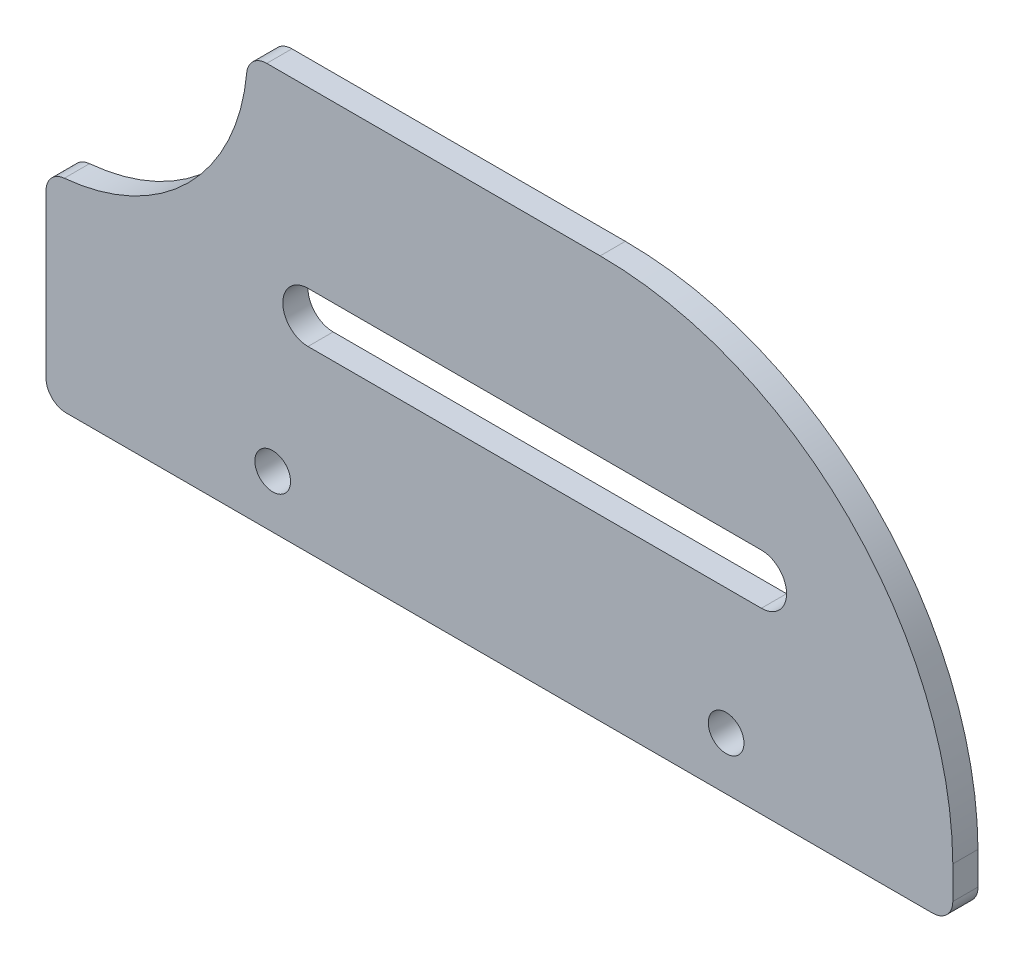
ISO-10303-21;
HEADER;
FILE_DESCRIPTION(('STEP AP214'),'2;1');
FILE_NAME('part.step','',(''),(''),'','','');
FILE_SCHEMA(('AUTOMOTIVE_DESIGN { 1 0 10303 214 1 1 1 1 }'));
ENDSEC;
DATA;
#1=APPLICATION_CONTEXT('core data for automotive mechanical design processes');
#2=APPLICATION_PROTOCOL_DEFINITION('international standard','automotive_design',2000,#1);
#3=PRODUCT_CONTEXT('',#1,'mechanical');
#4=PRODUCT('Part','Part','',(#3));
#5=PRODUCT_RELATED_PRODUCT_CATEGORY('part','',(#4));
#6=PRODUCT_DEFINITION_FORMATION('','',#4);
#7=PRODUCT_DEFINITION_CONTEXT('part definition',#1,'design');
#8=PRODUCT_DEFINITION('design','',#6,#7);
#9=PRODUCT_DEFINITION_SHAPE('','',#8);
#10=(LENGTH_UNIT() NAMED_UNIT(*) SI_UNIT(.MILLI.,.METRE.));
#11=(NAMED_UNIT(*) PLANE_ANGLE_UNIT() SI_UNIT($,.RADIAN.));
#12=(NAMED_UNIT(*) SI_UNIT($,.STERADIAN.) SOLID_ANGLE_UNIT());
#13=UNCERTAINTY_MEASURE_WITH_UNIT(LENGTH_MEASURE(1.E-05),#10,'distance_accuracy_value','');
#14=(GEOMETRIC_REPRESENTATION_CONTEXT(3) GLOBAL_UNCERTAINTY_ASSIGNED_CONTEXT((#13)) GLOBAL_UNIT_ASSIGNED_CONTEXT((#10,
#11,#12)) REPRESENTATION_CONTEXT('',''));
#15=CARTESIAN_POINT('',(0.,0.,0.));
#16=DIRECTION('',(0.,0.,1.));
#17=DIRECTION('',(1.,0.,0.));
#18=AXIS2_PLACEMENT_3D('',#15,#16,#17);
#19=CARTESIAN_POINT('',(0.,50.8,3.175));
#20=DIRECTION('',(0.,1.,0.));
#21=DIRECTION('',(0.,0.,1.));
#22=AXIS2_PLACEMENT_3D('',#19,#20,#21);
#23=PLANE('',#22);
#24=DIRECTION('',(1.,0.,0.));
#25=VECTOR('',#24,1.);
#26=CARTESIAN_POINT('',(0.,50.8,0.));
#27=LINE('',#26,#25);
#28=CARTESIAN_POINT('',(27.8243059212624,50.8,0.));
#29=VERTEX_POINT('',#28);
#30=CARTESIAN_POINT('',(69.85,50.8,0.));
#31=VERTEX_POINT('',#30);
#32=EDGE_CURVE('E234',#29,#31,#27,.T.);
#33=ORIENTED_EDGE('',*,*,#32,.F.);
#34=DIRECTION('',(0.,0.,1.));
#35=VECTOR('',#34,1.);
#36=CARTESIAN_POINT('',(27.8243059212624,50.8,3.175));
#37=LINE('',#36,#35);
#38=CARTESIAN_POINT('',(27.8243059212624,50.8,3.175));
#39=VERTEX_POINT('',#38);
#40=EDGE_CURVE('E273',#29,#39,#37,.T.);
#41=ORIENTED_EDGE('',*,*,#40,.T.);
#42=DIRECTION('',(1.,0.,0.));
#43=VECTOR('',#42,1.);
#44=CARTESIAN_POINT('',(0.,50.8,3.175));
#45=LINE('',#44,#43);
#46=CARTESIAN_POINT('',(69.85,50.8,3.175));
#47=VERTEX_POINT('',#46);
#48=EDGE_CURVE('E237',#39,#47,#45,.T.);
#49=ORIENTED_EDGE('',*,*,#48,.T.);
#50=DIRECTION('',(0.,0.,1.));
#51=VECTOR('',#50,1.);
#52=CARTESIAN_POINT('',(69.85,50.8,0.));
#53=LINE('',#52,#51);
#54=EDGE_CURVE('E226',#31,#47,#53,.T.);
#55=ORIENTED_EDGE('',*,*,#54,.F.);
#56=EDGE_LOOP('',(#33,#41,#49,#55));
#57=FACE_BOUND('',#56,.T.);
#58=ADVANCED_FACE('F73',(#57),#23,.T.);
#59=CARTESIAN_POINT('',(0.,0.,3.175));
#60=DIRECTION('',(0.,0.,1.));
#61=DIRECTION('',(1.,0.,0.));
#62=AXIS2_PLACEMENT_3D('',#59,#60,#61);
#63=PLANE('',#62);
#64=CARTESIAN_POINT('',(28.575,6.65,3.175));
#65=DIRECTION('',(0.,0.,1.));
#66=DIRECTION('',(1.,0.,0.));
#67=AXIS2_PLACEMENT_3D('',#64,#65,#66);
#68=CIRCLE('',#67,2.25);
#69=CARTESIAN_POINT('',(30.825,6.65,3.175));
#70=VERTEX_POINT('',#69);
#71=EDGE_CURVE('E489',#70,#70,#68,.T.);
#72=ORIENTED_EDGE('',*,*,#71,.F.);
#73=EDGE_LOOP('',(#72));
#74=FACE_BOUND('',#73,.T.);
#75=ORIENTED_EDGE('',*,*,#48,.F.);
#76=CARTESIAN_POINT('',(27.8243059212624,48.26,3.175));
#77=DIRECTION('',(0.,0.,1.));
#78=DIRECTION('',(1.,0.,0.));
#79=AXIS2_PLACEMENT_3D('',#76,#77,#78);
#80=CIRCLE('',#79,2.54);
#81=CARTESIAN_POINT('',(25.294823564784,48.4909090909091,3.175));
#82=VERTEX_POINT('',#81);
#83=EDGE_CURVE('E280',#39,#82,#80,.T.);
#84=ORIENTED_EDGE('',*,*,#83,.T.);
#85=CARTESIAN_POINT('',(0.,50.8,3.175));
#86=DIRECTION('',(0.,0.,1.));
#87=DIRECTION('',(1.,0.,0.));
#88=AXIS2_PLACEMENT_3D('',#85,#86,#87);
#89=CIRCLE('',#88,25.4);
#90=CARTESIAN_POINT('',(2.30909090909091,25.505176435216,3.175));
#91=VERTEX_POINT('',#90);
#92=EDGE_CURVE('E239',#82,#91,#89,.F.);
#93=ORIENTED_EDGE('',*,*,#92,.T.);
#94=CARTESIAN_POINT('',(2.54,22.9756940787376,3.175));
#95=DIRECTION('',(0.,0.,1.));
#96=DIRECTION('',(1.,0.,0.));
#97=AXIS2_PLACEMENT_3D('',#94,#95,#96);
#98=CIRCLE('',#97,2.54);
#99=CARTESIAN_POINT('',(0.,22.9756940787376,3.175));
#100=VERTEX_POINT('',#99);
#101=EDGE_CURVE('E278',#91,#100,#98,.T.);
#102=ORIENTED_EDGE('',*,*,#101,.T.);
#103=DIRECTION('',(0.,1.,0.));
#104=VECTOR('',#103,1.);
#105=CARTESIAN_POINT('',(0.,0.,3.175));
#106=LINE('',#105,#104);
#107=CARTESIAN_POINT('',(0.,2.54,3.175));
#108=VERTEX_POINT('',#107);
#109=EDGE_CURVE('E243',#108,#100,#106,.T.);
#110=ORIENTED_EDGE('',*,*,#109,.F.);
#111=CARTESIAN_POINT('',(2.54,2.54,3.175));
#112=DIRECTION('',(0.,0.,1.));
#113=DIRECTION('',(1.,0.,0.));
#114=AXIS2_PLACEMENT_3D('',#111,#112,#113);
#115=CIRCLE('',#114,2.54);
#116=CARTESIAN_POINT('',(2.54,0.,3.175));
#117=VERTEX_POINT('',#116);
#118=EDGE_CURVE('E276',#108,#117,#115,.T.);
#119=ORIENTED_EDGE('',*,*,#118,.T.);
#120=DIRECTION('',(1.,0.,0.));
#121=VECTOR('',#120,1.);
#122=CARTESIAN_POINT('',(0.,0.,3.175));
#123=LINE('',#122,#121);
#124=CARTESIAN_POINT('',(111.76,0.,3.175));
#125=VERTEX_POINT('',#124);
#126=EDGE_CURVE('E246',#117,#125,#123,.T.);
#127=ORIENTED_EDGE('',*,*,#126,.T.);
#128=CARTESIAN_POINT('',(111.76,2.54,3.175));
#129=DIRECTION('',(0.,0.,1.));
#130=DIRECTION('',(1.,0.,0.));
#131=AXIS2_PLACEMENT_3D('',#128,#129,#130);
#132=CIRCLE('',#131,2.54);
#133=CARTESIAN_POINT('',(114.3,2.54,3.175));
#134=VERTEX_POINT('',#133);
#135=EDGE_CURVE('E88',#125,#134,#132,.T.);
#136=ORIENTED_EDGE('',*,*,#135,.T.);
#137=DIRECTION('',(0.,1.,0.));
#138=VECTOR('',#137,1.);
#139=CARTESIAN_POINT('',(114.3,0.,3.175));
#140=LINE('',#139,#138);
#141=CARTESIAN_POINT('',(114.3,6.65000000000052,3.175));
#142=VERTEX_POINT('',#141);
#143=EDGE_CURVE('E248',#134,#142,#140,.T.);
#144=ORIENTED_EDGE('',*,*,#143,.T.);
#145=CARTESIAN_POINT('',(69.85,6.34898074745184,3.175));
#146=DIRECTION('',(0.,0.,1.));
#147=DIRECTION('',(1.,0.,0.));
#148=AXIS2_PLACEMENT_3D('',#145,#146,#147);
#149=CIRCLE('',#148,44.4510192525482);
#150=EDGE_CURVE('E227',#47,#142,#149,.F.);
#151=ORIENTED_EDGE('',*,*,#150,.F.);
#152=EDGE_LOOP('',(#75,#84,#93,#102,#110,#119,#127,#136,#144,#151));
#153=FACE_BOUND('',#152,.T.);
#154=DIRECTION('',(-1.,0.,0.));
#155=VECTOR('',#154,1.);
#156=CARTESIAN_POINT('',(0.,28.8434724613247,3.175));
#157=LINE('',#156,#155);
#158=CARTESIAN_POINT('',(90.17,28.8434724613247,3.175));
#159=VERTEX_POINT('',#158);
#160=CARTESIAN_POINT('',(33.02,28.8434724613247,3.175));
#161=VERTEX_POINT('',#160);
#162=EDGE_CURVE('E183',#159,#161,#157,.T.);
#163=ORIENTED_EDGE('',*,*,#162,.F.);
#164=CARTESIAN_POINT('',(90.17,25.6684724613247,3.175));
#165=DIRECTION('',(0.,0.,1.));
#166=DIRECTION('',(1.,0.,0.));
#167=AXIS2_PLACEMENT_3D('',#164,#165,#166);
#168=CIRCLE('',#167,3.175);
#169=CARTESIAN_POINT('',(90.17,22.4934724613247,3.175));
#170=VERTEX_POINT('',#169);
#171=EDGE_CURVE('E201',#170,#159,#168,.T.);
#172=ORIENTED_EDGE('',*,*,#171,.F.);
#173=DIRECTION('',(-1.,0.,0.));
#174=VECTOR('',#173,1.);
#175=CARTESIAN_POINT('',(0.,22.4934724613247,3.175));
#176=LINE('',#175,#174);
#177=CARTESIAN_POINT('',(33.02,22.4934724613247,3.175));
#178=VERTEX_POINT('',#177);
#179=EDGE_CURVE('E204',#170,#178,#176,.T.);
#180=ORIENTED_EDGE('',*,*,#179,.T.);
#181=CARTESIAN_POINT('',(33.02,25.6684724613247,3.175));
#182=DIRECTION('',(0.,0.,1.));
#183=DIRECTION('',(1.,0.,0.));
#184=AXIS2_PLACEMENT_3D('',#181,#182,#183);
#185=CIRCLE('',#184,3.175);
#186=EDGE_CURVE('E213',#161,#178,#185,.T.);
#187=ORIENTED_EDGE('',*,*,#186,.F.);
#188=EDGE_LOOP('',(#163,#172,#180,#187));
#189=FACE_BOUND('',#188,.T.);
#190=CARTESIAN_POINT('',(85.725,6.65,3.175));
#191=DIRECTION('',(0.,0.,1.));
#192=DIRECTION('',(1.,0.,0.));
#193=AXIS2_PLACEMENT_3D('',#190,#191,#192);
#194=CIRCLE('',#193,2.25);
#195=CARTESIAN_POINT('',(87.975,6.65,3.175));
#196=VERTEX_POINT('',#195);
#197=EDGE_CURVE('E207',#196,#196,#194,.T.);
#198=ORIENTED_EDGE('',*,*,#197,.F.);
#199=EDGE_LOOP('',(#198));
#200=FACE_BOUND('',#199,.T.);
#201=ADVANCED_FACE('F305',(#74,#153,#189,#200),#63,.T.);
#202=CARTESIAN_POINT('',(0.,0.,0.));
#203=DIRECTION('',(0.,0.,1.));
#204=DIRECTION('',(1.,0.,0.));
#205=AXIS2_PLACEMENT_3D('',#202,#203,#204);
#206=PLANE('',#205);
#207=CARTESIAN_POINT('',(90.17,25.6684724613247,0.));
#208=DIRECTION('',(0.,0.,1.));
#209=DIRECTION('',(1.,0.,0.));
#210=AXIS2_PLACEMENT_3D('',#207,#208,#209);
#211=CIRCLE('',#210,3.175);
#212=CARTESIAN_POINT('',(90.17,22.4934724613247,0.));
#213=VERTEX_POINT('',#212);
#214=CARTESIAN_POINT('',(90.17,28.8434724613247,0.));
#215=VERTEX_POINT('',#214);
#216=EDGE_CURVE('E188',#213,#215,#211,.T.);
#217=ORIENTED_EDGE('',*,*,#216,.T.);
#218=DIRECTION('',(-1.,0.,0.));
#219=VECTOR('',#218,1.);
#220=CARTESIAN_POINT('',(0.,28.8434724613247,0.));
#221=LINE('',#220,#219);
#222=CARTESIAN_POINT('',(33.02,28.8434724613247,0.));
#223=VERTEX_POINT('',#222);
#224=EDGE_CURVE('E180',#215,#223,#221,.T.);
#225=ORIENTED_EDGE('',*,*,#224,.T.);
#226=CARTESIAN_POINT('',(33.02,25.6684724613247,0.));
#227=DIRECTION('',(0.,0.,1.));
#228=DIRECTION('',(1.,0.,0.));
#229=AXIS2_PLACEMENT_3D('',#226,#227,#228);
#230=CIRCLE('',#229,3.175);
#231=CARTESIAN_POINT('',(33.02,22.4934724613247,0.));
#232=VERTEX_POINT('',#231);
#233=EDGE_CURVE('E191',#223,#232,#230,.T.);
#234=ORIENTED_EDGE('',*,*,#233,.T.);
#235=DIRECTION('',(-1.,0.,0.));
#236=VECTOR('',#235,1.);
#237=CARTESIAN_POINT('',(0.,22.4934724613247,0.));
#238=LINE('',#237,#236);
#239=EDGE_CURVE('E196',#213,#232,#238,.T.);
#240=ORIENTED_EDGE('',*,*,#239,.F.);
#241=EDGE_LOOP('',(#217,#225,#234,#240));
#242=FACE_BOUND('',#241,.T.);
#243=CARTESIAN_POINT('',(28.575,6.65,0.));
#244=DIRECTION('',(0.,0.,1.));
#245=DIRECTION('',(1.,0.,0.));
#246=AXIS2_PLACEMENT_3D('',#243,#244,#245);
#247=CIRCLE('',#246,2.25);
#248=CARTESIAN_POINT('',(30.825,6.65,0.));
#249=VERTEX_POINT('',#248);
#250=EDGE_CURVE('E214',#249,#249,#247,.T.);
#251=ORIENTED_EDGE('',*,*,#250,.T.);
#252=EDGE_LOOP('',(#251));
#253=FACE_BOUND('',#252,.T.);
#254=CARTESIAN_POINT('',(0.,50.8,0.));
#255=DIRECTION('',(0.,0.,1.));
#256=DIRECTION('',(1.,0.,0.));
#257=AXIS2_PLACEMENT_3D('',#254,#255,#256);
#258=CIRCLE('',#257,25.4);
#259=CARTESIAN_POINT('',(25.294823564784,48.4909090909091,0.));
#260=VERTEX_POINT('',#259);
#261=CARTESIAN_POINT('',(2.30909090909091,25.505176435216,0.));
#262=VERTEX_POINT('',#261);
#263=EDGE_CURVE('E252',#260,#262,#258,.F.);
#264=ORIENTED_EDGE('',*,*,#263,.F.);
#265=CARTESIAN_POINT('',(27.8243059212624,48.26,0.));
#266=DIRECTION('',(0.,0.,1.));
#267=DIRECTION('',(1.,0.,0.));
#268=AXIS2_PLACEMENT_3D('',#265,#266,#267);
#269=CIRCLE('',#268,2.54);
#270=EDGE_CURVE('E271',#260,#29,#269,.F.);
#271=ORIENTED_EDGE('',*,*,#270,.T.);
#272=ORIENTED_EDGE('',*,*,#32,.T.);
#273=CARTESIAN_POINT('',(69.85,6.34898074745184,0.));
#274=DIRECTION('',(0.,0.,1.));
#275=DIRECTION('',(1.,0.,0.));
#276=AXIS2_PLACEMENT_3D('',#273,#274,#275);
#277=CIRCLE('',#276,44.4510192525482);
#278=CARTESIAN_POINT('',(114.3,6.65000000000052,0.));
#279=VERTEX_POINT('',#278);
#280=EDGE_CURVE('E223',#31,#279,#277,.F.);
#281=ORIENTED_EDGE('',*,*,#280,.T.);
#282=DIRECTION('',(0.,1.,0.));
#283=VECTOR('',#282,1.);
#284=CARTESIAN_POINT('',(114.3,0.,0.));
#285=LINE('',#284,#283);
#286=CARTESIAN_POINT('',(114.3,2.54,0.));
#287=VERTEX_POINT('',#286);
#288=EDGE_CURVE('E240',#287,#279,#285,.T.);
#289=ORIENTED_EDGE('',*,*,#288,.F.);
#290=CARTESIAN_POINT('',(111.76,2.54,0.));
#291=DIRECTION('',(0.,0.,1.));
#292=DIRECTION('',(1.,0.,0.));
#293=AXIS2_PLACEMENT_3D('',#290,#291,#292);
#294=CIRCLE('',#293,2.54);
#295=CARTESIAN_POINT('',(111.76,0.,0.));
#296=VERTEX_POINT('',#295);
#297=EDGE_CURVE('E265',#287,#296,#294,.F.);
#298=ORIENTED_EDGE('',*,*,#297,.T.);
#299=DIRECTION('',(1.,0.,0.));
#300=VECTOR('',#299,1.);
#301=CARTESIAN_POINT('',(0.,0.,0.));
#302=LINE('',#301,#300);
#303=CARTESIAN_POINT('',(2.54,0.,0.));
#304=VERTEX_POINT('',#303);
#305=EDGE_CURVE('E258',#304,#296,#302,.T.);
#306=ORIENTED_EDGE('',*,*,#305,.F.);
#307=CARTESIAN_POINT('',(2.54,2.54,0.));
#308=DIRECTION('',(0.,0.,1.));
#309=DIRECTION('',(1.,0.,0.));
#310=AXIS2_PLACEMENT_3D('',#307,#308,#309);
#311=CIRCLE('',#310,2.54);
#312=CARTESIAN_POINT('',(0.,2.54,0.));
#313=VERTEX_POINT('',#312);
#314=EDGE_CURVE('E267',#304,#313,#311,.F.);
#315=ORIENTED_EDGE('',*,*,#314,.T.);
#316=DIRECTION('',(0.,1.,0.));
#317=VECTOR('',#316,1.);
#318=CARTESIAN_POINT('',(0.,0.,0.));
#319=LINE('',#318,#317);
#320=CARTESIAN_POINT('',(0.,22.9756940787376,0.));
#321=VERTEX_POINT('',#320);
#322=EDGE_CURVE('E255',#313,#321,#319,.T.);
#323=ORIENTED_EDGE('',*,*,#322,.T.);
#324=CARTESIAN_POINT('',(2.54,22.9756940787376,0.));
#325=DIRECTION('',(0.,0.,1.));
#326=DIRECTION('',(1.,0.,0.));
#327=AXIS2_PLACEMENT_3D('',#324,#325,#326);
#328=CIRCLE('',#327,2.54);
#329=EDGE_CURVE('E269',#321,#262,#328,.F.);
#330=ORIENTED_EDGE('',*,*,#329,.T.);
#331=EDGE_LOOP('',(#264,#271,#272,#281,#289,#298,#306,#315,#323,#330));
#332=FACE_BOUND('',#331,.T.);
#333=CARTESIAN_POINT('',(85.725,6.65,0.));
#334=DIRECTION('',(0.,0.,1.));
#335=DIRECTION('',(1.,0.,0.));
#336=AXIS2_PLACEMENT_3D('',#333,#334,#335);
#337=CIRCLE('',#336,2.25);
#338=CARTESIAN_POINT('',(87.975,6.65,0.));
#339=VERTEX_POINT('',#338);
#340=EDGE_CURVE('E230',#339,#339,#337,.T.);
#341=ORIENTED_EDGE('',*,*,#340,.T.);
#342=EDGE_LOOP('',(#341));
#343=FACE_BOUND('',#342,.T.);
#344=ADVANCED_FACE('F198',(#242,#253,#332,#343),#206,.F.);
#345=CARTESIAN_POINT('',(0.,50.8,3.175));
#346=DIRECTION('',(0.,0.,-1.));
#347=DIRECTION('',(-1.,0.,0.));
#348=AXIS2_PLACEMENT_3D('',#345,#346,#347);
#349=CYLINDRICAL_SURFACE('',#348,25.4);
#350=ORIENTED_EDGE('',*,*,#92,.F.);
#351=DIRECTION('',(0.,0.,-1.));
#352=VECTOR('',#351,1.);
#353=CARTESIAN_POINT('',(25.294823564784,48.4909090909091,3.175));
#354=LINE('',#353,#352);
#355=EDGE_CURVE('E262',#82,#260,#354,.T.);
#356=ORIENTED_EDGE('',*,*,#355,.T.);
#357=ORIENTED_EDGE('',*,*,#263,.T.);
#358=DIRECTION('',(0.,0.,-1.));
#359=VECTOR('',#358,1.);
#360=CARTESIAN_POINT('',(2.30909090909091,25.505176435216,3.175));
#361=LINE('',#360,#359);
#362=EDGE_CURVE('E250',#262,#91,#361,.F.);
#363=ORIENTED_EDGE('',*,*,#362,.T.);
#364=EDGE_LOOP('',(#350,#356,#357,#363));
#365=FACE_BOUND('',#364,.T.);
#366=ADVANCED_FACE('F320',(#365),#349,.F.);
#367=CARTESIAN_POINT('',(0.,0.,3.175));
#368=DIRECTION('',(-1.,0.,0.));
#369=DIRECTION('',(0.,0.,1.));
#370=AXIS2_PLACEMENT_3D('',#367,#368,#369);
#371=PLANE('',#370);
#372=ORIENTED_EDGE('',*,*,#109,.T.);
#373=DIRECTION('',(0.,0.,1.));
#374=VECTOR('',#373,1.);
#375=CARTESIAN_POINT('',(0.,22.9756940787376,0.));
#376=LINE('',#375,#374);
#377=EDGE_CURVE('E284',#100,#321,#376,.F.);
#378=ORIENTED_EDGE('',*,*,#377,.T.);
#379=ORIENTED_EDGE('',*,*,#322,.F.);
#380=DIRECTION('',(0.,0.,-1.));
#381=VECTOR('',#380,1.);
#382=CARTESIAN_POINT('',(0.,2.54,3.175));
#383=LINE('',#382,#381);
#384=EDGE_CURVE('E282',#313,#108,#383,.F.);
#385=ORIENTED_EDGE('',*,*,#384,.T.);
#386=EDGE_LOOP('',(#372,#378,#379,#385));
#387=FACE_BOUND('',#386,.T.);
#388=ADVANCED_FACE('F327',(#387),#371,.T.);
#389=CARTESIAN_POINT('',(0.,0.,3.175));
#390=DIRECTION('',(0.,1.,0.));
#391=DIRECTION('',(0.,0.,1.));
#392=AXIS2_PLACEMENT_3D('',#389,#390,#391);
#393=PLANE('',#392);
#394=ORIENTED_EDGE('',*,*,#126,.F.);
#395=DIRECTION('',(0.,0.,-1.));
#396=VECTOR('',#395,1.);
#397=CARTESIAN_POINT('',(2.54,0.,0.));
#398=LINE('',#397,#396);
#399=EDGE_CURVE('E81',#117,#304,#398,.T.);
#400=ORIENTED_EDGE('',*,*,#399,.T.);
#401=ORIENTED_EDGE('',*,*,#305,.T.);
#402=DIRECTION('',(0.,0.,-1.));
#403=VECTOR('',#402,1.);
#404=CARTESIAN_POINT('',(111.76,0.,3.175));
#405=LINE('',#404,#403);
#406=EDGE_CURVE('E96',#296,#125,#405,.F.);
#407=ORIENTED_EDGE('',*,*,#406,.T.);
#408=EDGE_LOOP('',(#394,#400,#401,#407));
#409=FACE_BOUND('',#408,.T.);
#410=ADVANCED_FACE('F290',(#409),#393,.F.);
#411=CARTESIAN_POINT('',(114.3,0.,3.175));
#412=DIRECTION('',(-1.,0.,0.));
#413=DIRECTION('',(0.,-1.,0.));
#414=AXIS2_PLACEMENT_3D('',#411,#412,#413);
#415=PLANE('',#414);
#416=ORIENTED_EDGE('',*,*,#143,.F.);
#417=DIRECTION('',(0.,0.,-1.));
#418=VECTOR('',#417,1.);
#419=CARTESIAN_POINT('',(114.3,2.54,3.175));
#420=LINE('',#419,#418);
#421=EDGE_CURVE('E12',#134,#287,#420,.T.);
#422=ORIENTED_EDGE('',*,*,#421,.T.);
#423=ORIENTED_EDGE('',*,*,#288,.T.);
#424=DIRECTION('',(0.,0.,1.));
#425=VECTOR('',#424,1.);
#426=CARTESIAN_POINT('',(114.3,6.65000000000052,0.));
#427=LINE('',#426,#425);
#428=EDGE_CURVE('E231',#279,#142,#427,.T.);
#429=ORIENTED_EDGE('',*,*,#428,.T.);
#430=EDGE_LOOP('',(#416,#422,#423,#429));
#431=FACE_BOUND('',#430,.T.);
#432=ADVANCED_FACE('F301',(#431),#415,.F.);
#433=CARTESIAN_POINT('',(69.85,6.34898074745184,0.));
#434=DIRECTION('',(0.,0.,1.));
#435=DIRECTION('',(1.,0.,0.));
#436=AXIS2_PLACEMENT_3D('',#433,#434,#435);
#437=CYLINDRICAL_SURFACE('',#436,44.4510192525482);
#438=ORIENTED_EDGE('',*,*,#150,.T.);
#439=ORIENTED_EDGE('',*,*,#428,.F.);
#440=ORIENTED_EDGE('',*,*,#280,.F.);
#441=ORIENTED_EDGE('',*,*,#54,.T.);
#442=EDGE_LOOP('',(#438,#439,#440,#441));
#443=FACE_BOUND('',#442,.T.);
#444=ADVANCED_FACE('F308',(#443),#437,.T.);
#445=CARTESIAN_POINT('',(28.575,6.65,0.));
#446=DIRECTION('',(0.,0.,1.));
#447=DIRECTION('',(1.,0.,0.));
#448=AXIS2_PLACEMENT_3D('',#445,#446,#447);
#449=CYLINDRICAL_SURFACE('',#448,2.25);
#450=ORIENTED_EDGE('',*,*,#250,.F.);
#451=EDGE_LOOP('',(#450));
#452=FACE_BOUND('',#451,.T.);
#453=ORIENTED_EDGE('',*,*,#71,.T.);
#454=EDGE_LOOP('',(#453));
#455=FACE_BOUND('',#454,.T.);
#456=ADVANCED_FACE('F363',(#452,#455),#449,.F.);
#457=CARTESIAN_POINT('',(0.,28.8434724613247,0.));
#458=DIRECTION('',(0.,1.,0.));
#459=DIRECTION('',(-1.,0.,0.));
#460=AXIS2_PLACEMENT_3D('',#457,#458,#459);
#461=PLANE('',#460);
#462=ORIENTED_EDGE('',*,*,#162,.T.);
#463=DIRECTION('',(0.,0.,1.));
#464=VECTOR('',#463,1.);
#465=CARTESIAN_POINT('',(33.02,28.8434724613247,0.));
#466=LINE('',#465,#464);
#467=EDGE_CURVE('E176',#223,#161,#466,.T.);
#468=ORIENTED_EDGE('',*,*,#467,.F.);
#469=ORIENTED_EDGE('',*,*,#224,.F.);
#470=DIRECTION('',(0.,0.,1.));
#471=VECTOR('',#470,1.);
#472=CARTESIAN_POINT('',(90.17,28.8434724613247,0.));
#473=LINE('',#472,#471);
#474=EDGE_CURVE('E218',#215,#159,#473,.T.);
#475=ORIENTED_EDGE('',*,*,#474,.T.);
#476=EDGE_LOOP('',(#462,#468,#469,#475));
#477=FACE_BOUND('',#476,.T.);
#478=ADVANCED_FACE('F178',(#477),#461,.F.);
#479=CARTESIAN_POINT('',(90.17,25.6684724613247,0.));
#480=DIRECTION('',(0.,0.,1.));
#481=DIRECTION('',(1.,0.,0.));
#482=AXIS2_PLACEMENT_3D('',#479,#480,#481);
#483=CYLINDRICAL_SURFACE('',#482,3.175);
#484=ORIENTED_EDGE('',*,*,#171,.T.);
#485=ORIENTED_EDGE('',*,*,#474,.F.);
#486=ORIENTED_EDGE('',*,*,#216,.F.);
#487=DIRECTION('',(0.,0.,1.));
#488=VECTOR('',#487,1.);
#489=CARTESIAN_POINT('',(90.17,22.4934724613247,0.));
#490=LINE('',#489,#488);
#491=EDGE_CURVE('E220',#213,#170,#490,.T.);
#492=ORIENTED_EDGE('',*,*,#491,.T.);
#493=EDGE_LOOP('',(#484,#485,#486,#492));
#494=FACE_BOUND('',#493,.T.);
#495=ADVANCED_FACE('F364',(#494),#483,.F.);
#496=CARTESIAN_POINT('',(0.,22.4934724613247,0.));
#497=DIRECTION('',(0.,1.,0.));
#498=DIRECTION('',(-1.,0.,0.));
#499=AXIS2_PLACEMENT_3D('',#496,#497,#498);
#500=PLANE('',#499);
#501=ORIENTED_EDGE('',*,*,#179,.F.);
#502=ORIENTED_EDGE('',*,*,#491,.F.);
#503=ORIENTED_EDGE('',*,*,#239,.T.);
#504=DIRECTION('',(0.,0.,1.));
#505=VECTOR('',#504,1.);
#506=CARTESIAN_POINT('',(33.02,22.4934724613247,0.));
#507=LINE('',#506,#505);
#508=EDGE_CURVE('E187',#232,#178,#507,.T.);
#509=ORIENTED_EDGE('',*,*,#508,.T.);
#510=EDGE_LOOP('',(#501,#502,#503,#509));
#511=FACE_BOUND('',#510,.T.);
#512=ADVANCED_FACE('F357',(#511),#500,.T.);
#513=CARTESIAN_POINT('',(33.02,25.6684724613247,0.));
#514=DIRECTION('',(0.,0.,1.));
#515=DIRECTION('',(1.,0.,0.));
#516=AXIS2_PLACEMENT_3D('',#513,#514,#515);
#517=CYLINDRICAL_SURFACE('',#516,3.175);
#518=ORIENTED_EDGE('',*,*,#186,.T.);
#519=ORIENTED_EDGE('',*,*,#508,.F.);
#520=ORIENTED_EDGE('',*,*,#233,.F.);
#521=ORIENTED_EDGE('',*,*,#467,.T.);
#522=EDGE_LOOP('',(#518,#519,#520,#521));
#523=FACE_BOUND('',#522,.T.);
#524=ADVANCED_FACE('F192',(#523),#517,.F.);
#525=CARTESIAN_POINT('',(85.725,6.65,0.));
#526=DIRECTION('',(0.,0.,1.));
#527=DIRECTION('',(1.,0.,0.));
#528=AXIS2_PLACEMENT_3D('',#525,#526,#527);
#529=CYLINDRICAL_SURFACE('',#528,2.25);
#530=ORIENTED_EDGE('',*,*,#340,.F.);
#531=EDGE_LOOP('',(#530));
#532=FACE_BOUND('',#531,.T.);
#533=ORIENTED_EDGE('',*,*,#197,.T.);
#534=EDGE_LOOP('',(#533));
#535=FACE_BOUND('',#534,.T.);
#536=ADVANCED_FACE('F348',(#532,#535),#529,.F.);
#537=CARTESIAN_POINT('',(27.8243059212624,48.26,3.175));
#538=DIRECTION('',(0.,0.,-1.));
#539=DIRECTION('',(-1.,0.,0.));
#540=AXIS2_PLACEMENT_3D('',#537,#538,#539);
#541=CYLINDRICAL_SURFACE('',#540,2.54);
#542=ORIENTED_EDGE('',*,*,#83,.F.);
#543=ORIENTED_EDGE('',*,*,#40,.F.);
#544=ORIENTED_EDGE('',*,*,#270,.F.);
#545=ORIENTED_EDGE('',*,*,#355,.F.);
#546=EDGE_LOOP('',(#542,#543,#544,#545));
#547=FACE_BOUND('',#546,.T.);
#548=ADVANCED_FACE('F318',(#547),#541,.T.);
#549=CARTESIAN_POINT('',(2.54,22.9756940787376,3.175));
#550=DIRECTION('',(0.,0.,-1.));
#551=DIRECTION('',(-1.,0.,0.));
#552=AXIS2_PLACEMENT_3D('',#549,#550,#551);
#553=CYLINDRICAL_SURFACE('',#552,2.54);
#554=ORIENTED_EDGE('',*,*,#101,.F.);
#555=ORIENTED_EDGE('',*,*,#362,.F.);
#556=ORIENTED_EDGE('',*,*,#329,.F.);
#557=ORIENTED_EDGE('',*,*,#377,.F.);
#558=EDGE_LOOP('',(#554,#555,#556,#557));
#559=FACE_BOUND('',#558,.T.);
#560=ADVANCED_FACE('F325',(#559),#553,.T.);
#561=CARTESIAN_POINT('',(2.54,2.54,3.175));
#562=DIRECTION('',(0.,0.,1.));
#563=DIRECTION('',(1.,0.,0.));
#564=AXIS2_PLACEMENT_3D('',#561,#562,#563);
#565=CYLINDRICAL_SURFACE('',#564,2.54);
#566=ORIENTED_EDGE('',*,*,#118,.F.);
#567=ORIENTED_EDGE('',*,*,#384,.F.);
#568=ORIENTED_EDGE('',*,*,#314,.F.);
#569=ORIENTED_EDGE('',*,*,#399,.F.);
#570=EDGE_LOOP('',(#566,#567,#568,#569));
#571=FACE_BOUND('',#570,.T.);
#572=ADVANCED_FACE('F330',(#571),#565,.T.);
#573=CARTESIAN_POINT('',(111.76,2.54,3.175));
#574=DIRECTION('',(0.,0.,-1.));
#575=DIRECTION('',(-1.,0.,0.));
#576=AXIS2_PLACEMENT_3D('',#573,#574,#575);
#577=CYLINDRICAL_SURFACE('',#576,2.54);
#578=ORIENTED_EDGE('',*,*,#135,.F.);
#579=ORIENTED_EDGE('',*,*,#406,.F.);
#580=ORIENTED_EDGE('',*,*,#297,.F.);
#581=ORIENTED_EDGE('',*,*,#421,.F.);
#582=EDGE_LOOP('',(#578,#579,#580,#581));
#583=FACE_BOUND('',#582,.T.);
#584=ADVANCED_FACE('F75',(#583),#577,.T.);
#585=CLOSED_SHELL('',(#58,#201,#344,#366,#388,#410,#432,#444,#456,#478,#495,#512,#524,#536,#548,
#560,#572,#584));
#586=MANIFOLD_SOLID_BREP('B2',#585);
#587=ADVANCED_BREP_SHAPE_REPRESENTATION('',(#18,#586),#14);
#588=SHAPE_DEFINITION_REPRESENTATION(#9,#587);
ENDSEC;
END-ISO-10303-21;
